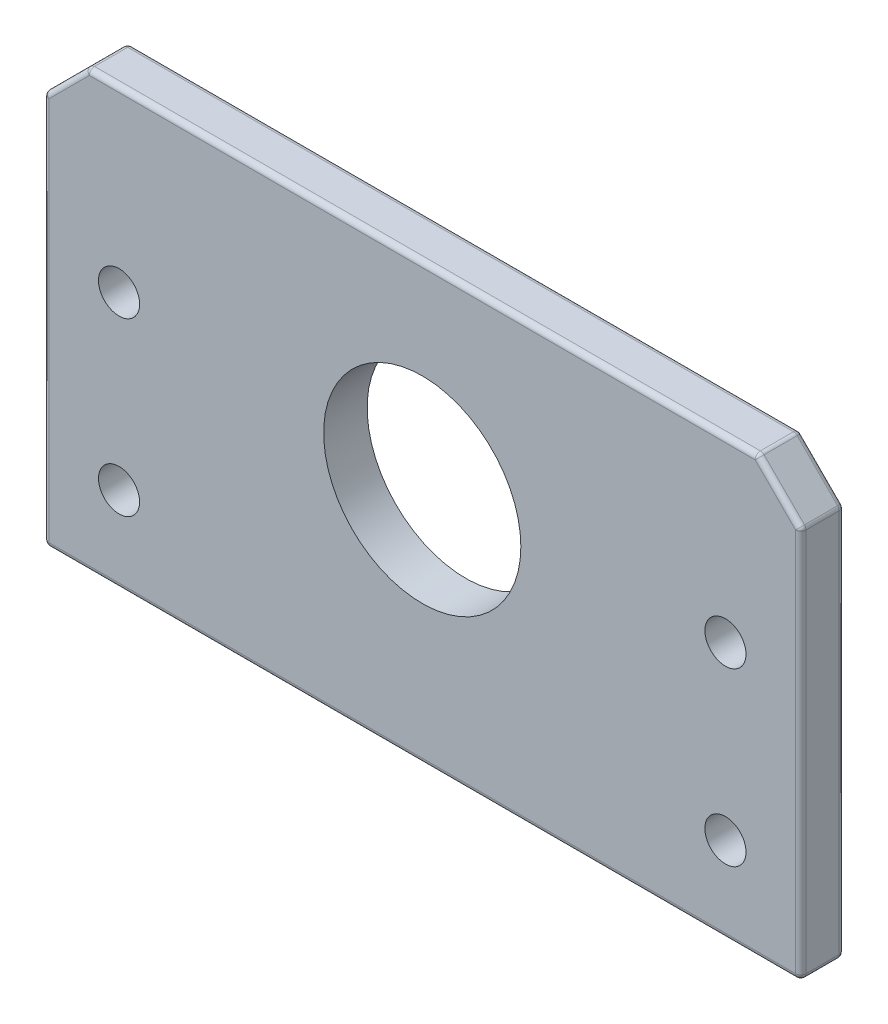
ISO-10303-21;
HEADER;
FILE_DESCRIPTION(('STEP AP214'),'2;1');
FILE_NAME('part.step','',(''),(''),'','','');
FILE_SCHEMA(('AUTOMOTIVE_DESIGN { 1 0 10303 214 1 1 1 1 }'));
ENDSEC;
DATA;
#1=APPLICATION_CONTEXT('core data for automotive mechanical design processes');
#2=APPLICATION_PROTOCOL_DEFINITION('international standard','automotive_design',2000,#1);
#3=PRODUCT_CONTEXT('',#1,'mechanical');
#4=PRODUCT('Part','Part','',(#3));
#5=PRODUCT_RELATED_PRODUCT_CATEGORY('part','',(#4));
#6=PRODUCT_DEFINITION_FORMATION('','',#4);
#7=PRODUCT_DEFINITION_CONTEXT('part definition',#1,'design');
#8=PRODUCT_DEFINITION('design','',#6,#7);
#9=PRODUCT_DEFINITION_SHAPE('','',#8);
#10=(LENGTH_UNIT() NAMED_UNIT(*) SI_UNIT(.MILLI.,.METRE.));
#11=(NAMED_UNIT(*) PLANE_ANGLE_UNIT() SI_UNIT($,.RADIAN.));
#12=(NAMED_UNIT(*) SI_UNIT($,.STERADIAN.) SOLID_ANGLE_UNIT());
#13=UNCERTAINTY_MEASURE_WITH_UNIT(LENGTH_MEASURE(1.E-05),#10,'distance_accuracy_value','');
#14=(GEOMETRIC_REPRESENTATION_CONTEXT(3) GLOBAL_UNCERTAINTY_ASSIGNED_CONTEXT((#13)) GLOBAL_UNIT_ASSIGNED_CONTEXT((#10,
#11,#12)) REPRESENTATION_CONTEXT('',''));
#15=CARTESIAN_POINT('',(0.,0.,0.));
#16=DIRECTION('',(0.,0.,1.));
#17=DIRECTION('',(1.,0.,0.));
#18=AXIS2_PLACEMENT_3D('',#15,#16,#17);
#19=CARTESIAN_POINT('',(-55.245,-63.5,3.175));
#20=DIRECTION('',(0.,0.,1.));
#21=DIRECTION('',(1.,0.,0.));
#22=AXIS2_PLACEMENT_3D('',#19,#20,#21);
#23=PLANE('',#22);
#24=DIRECTION('',(0.,1.,0.));
#25=VECTOR('',#24,1.);
#26=CARTESIAN_POINT('',(-54.483,-63.5,3.175));
#27=LINE('',#26,#25);
#28=CARTESIAN_POINT('',(-54.483,-6.66563073452831,3.175));
#29=VERTEX_POINT('',#28);
#30=CARTESIAN_POINT('',(-54.483,-62.738,3.175));
#31=VERTEX_POINT('',#30);
#32=EDGE_CURVE('E175',#29,#31,#27,.F.);
#33=ORIENTED_EDGE('',*,*,#32,.T.);
#34=DIRECTION('',(1.,0.,0.));
#35=VECTOR('',#34,1.);
#36=CARTESIAN_POINT('',(55.245,-62.738,3.175));
#37=LINE('',#36,#35);
#38=CARTESIAN_POINT('',(54.483,-62.738,3.175));
#39=VERTEX_POINT('',#38);
#40=EDGE_CURVE('E226',#31,#39,#37,.T.);
#41=ORIENTED_EDGE('',*,*,#40,.T.);
#42=DIRECTION('',(0.,1.,0.));
#43=VECTOR('',#42,1.);
#44=CARTESIAN_POINT('',(54.483,-63.5,3.175));
#45=LINE('',#44,#43);
#46=CARTESIAN_POINT('',(54.483,-6.66563073452829,3.175));
#47=VERTEX_POINT('',#46);
#48=EDGE_CURVE('E223',#39,#47,#45,.T.);
#49=ORIENTED_EDGE('',*,*,#48,.T.);
#50=DIRECTION('',(0.707106781186546,-0.707106781186549,0.));
#51=VECTOR('',#50,1.);
#52=CARTESIAN_POINT('',(28.0361846327361,19.7811846327357,3.175));
#53=LINE('',#52,#51);
#54=CARTESIAN_POINT('',(48.5793692654717,-0.762,3.175));
#55=VERTEX_POINT('',#54);
#56=EDGE_CURVE('E220',#47,#55,#53,.F.);
#57=ORIENTED_EDGE('',*,*,#56,.T.);
#58=DIRECTION('',(1.,0.,0.));
#59=VECTOR('',#58,1.);
#60=CARTESIAN_POINT('',(-55.245,-0.761999999999999,3.175));
#61=LINE('',#60,#59);
#62=CARTESIAN_POINT('',(-48.5793692654717,-0.762000000000001,3.175));
#63=VERTEX_POINT('',#62);
#64=EDGE_CURVE('E178',#55,#63,#61,.F.);
#65=ORIENTED_EDGE('',*,*,#64,.T.);
#66=DIRECTION('',(0.707106781186546,0.707106781186549,0.));
#67=VECTOR('',#66,1.);
#68=CARTESIAN_POINT('',(-83.2811846327358,-35.4638153672643,3.175));
#69=LINE('',#68,#67);
#70=EDGE_CURVE('E170',#63,#29,#69,.F.);
#71=ORIENTED_EDGE('',*,*,#70,.T.);
#72=EDGE_LOOP('',(#33,#41,#49,#57,#65,#71));
#73=FACE_BOUND('',#72,.T.);
#74=CARTESIAN_POINT('',(-44.245,-51.,3.175));
#75=DIRECTION('',(0.,0.,-1.));
#76=DIRECTION('',(-1.,0.,0.));
#77=AXIS2_PLACEMENT_3D('',#74,#75,#76);
#78=CIRCLE('',#77,3.);
#79=CARTESIAN_POINT('',(-47.245,-51.,3.175));
#80=VERTEX_POINT('',#79);
#81=EDGE_CURVE('E461',#80,#80,#78,.T.);
#82=ORIENTED_EDGE('',*,*,#81,.T.);
#83=EDGE_LOOP('',(#82));
#84=FACE_BOUND('',#83,.T.);
#85=CARTESIAN_POINT('',(44.245,-51.,3.175));
#86=DIRECTION('',(0.,0.,-1.));
#87=DIRECTION('',(-1.,0.,0.));
#88=AXIS2_PLACEMENT_3D('',#85,#86,#87);
#89=CIRCLE('',#88,3.);
#90=CARTESIAN_POINT('',(41.245,-51.,3.175));
#91=VERTEX_POINT('',#90);
#92=EDGE_CURVE('E469',#91,#91,#89,.T.);
#93=ORIENTED_EDGE('',*,*,#92,.T.);
#94=EDGE_LOOP('',(#93));
#95=FACE_BOUND('',#94,.T.);
#96=CARTESIAN_POINT('',(0.,-28.8150046,3.175));
#97=DIRECTION('',(0.,0.,1.));
#98=DIRECTION('',(1.,0.,0.));
#99=AXIS2_PLACEMENT_3D('',#96,#97,#98);
#100=CIRCLE('',#99,14.3891);
#101=CARTESIAN_POINT('',(14.3891,-28.8150046,3.175));
#102=VERTEX_POINT('',#101);
#103=EDGE_CURVE('E214',#102,#102,#100,.T.);
#104=ORIENTED_EDGE('',*,*,#103,.F.);
#105=EDGE_LOOP('',(#104));
#106=FACE_BOUND('',#105,.T.);
#107=CARTESIAN_POINT('',(44.245,-26.,3.175));
#108=DIRECTION('',(0.,0.,-1.));
#109=DIRECTION('',(-1.,0.,0.));
#110=AXIS2_PLACEMENT_3D('',#107,#108,#109);
#111=CIRCLE('',#110,3.);
#112=CARTESIAN_POINT('',(41.245,-26.,3.175));
#113=VERTEX_POINT('',#112);
#114=EDGE_CURVE('E477',#113,#113,#111,.T.);
#115=ORIENTED_EDGE('',*,*,#114,.T.);
#116=EDGE_LOOP('',(#115));
#117=FACE_BOUND('',#116,.T.);
#118=CARTESIAN_POINT('',(-44.245,-26.,3.175));
#119=DIRECTION('',(0.,0.,-1.));
#120=DIRECTION('',(-1.,0.,0.));
#121=AXIS2_PLACEMENT_3D('',#118,#119,#120);
#122=CIRCLE('',#121,3.);
#123=CARTESIAN_POINT('',(-47.245,-26.,3.175));
#124=VERTEX_POINT('',#123);
#125=EDGE_CURVE('E449',#124,#124,#122,.T.);
#126=ORIENTED_EDGE('',*,*,#125,.T.);
#127=EDGE_LOOP('',(#126));
#128=FACE_BOUND('',#127,.T.);
#129=ADVANCED_FACE('F45',(#73,#84,#95,#106,#117,#128),#23,.T.);
#130=CARTESIAN_POINT('',(-55.245,-63.5,-3.175));
#131=DIRECTION('',(-1.,0.,0.));
#132=DIRECTION('',(0.,0.,1.));
#133=AXIS2_PLACEMENT_3D('',#130,#131,#132);
#134=PLANE('',#133);
#135=DIRECTION('',(0.,1.,0.));
#136=VECTOR('',#135,1.);
#137=CARTESIAN_POINT('',(-55.245,-63.5,-2.413));
#138=LINE('',#137,#136);
#139=CARTESIAN_POINT('',(-55.245,-6.66563073452831,-2.413));
#140=VERTEX_POINT('',#139);
#141=CARTESIAN_POINT('',(-55.245,-62.738,-2.413));
#142=VERTEX_POINT('',#141);
#143=EDGE_CURVE('E55',#140,#142,#138,.F.);
#144=ORIENTED_EDGE('',*,*,#143,.T.);
#145=DIRECTION('',(0.,0.,1.));
#146=VECTOR('',#145,1.);
#147=CARTESIAN_POINT('',(-55.245,-62.738,3.175));
#148=LINE('',#147,#146);
#149=CARTESIAN_POINT('',(-55.245,-62.738,2.413));
#150=VERTEX_POINT('',#149);
#151=EDGE_CURVE('E11',#142,#150,#148,.T.);
#152=ORIENTED_EDGE('',*,*,#151,.T.);
#153=DIRECTION('',(0.,1.,0.));
#154=VECTOR('',#153,1.);
#155=CARTESIAN_POINT('',(-55.245,-63.5,2.413));
#156=LINE('',#155,#154);
#157=CARTESIAN_POINT('',(-55.245,-6.66563073452831,2.413));
#158=VERTEX_POINT('',#157);
#159=EDGE_CURVE('E312',#150,#158,#156,.T.);
#160=ORIENTED_EDGE('',*,*,#159,.T.);
#161=DIRECTION('',(0.,0.,1.));
#162=VECTOR('',#161,1.);
#163=CARTESIAN_POINT('',(-55.245,-6.66563073452831,-3.175));
#164=LINE('',#163,#162);
#165=EDGE_CURVE('E66',#158,#140,#164,.F.);
#166=ORIENTED_EDGE('',*,*,#165,.T.);
#167=EDGE_LOOP('',(#144,#152,#160,#166));
#168=FACE_BOUND('',#167,.T.);
#169=ADVANCED_FACE('F489',(#168),#134,.T.);
#170=CARTESIAN_POINT('',(-55.245,-63.5,-3.175));
#171=DIRECTION('',(0.,0.,-1.));
#172=DIRECTION('',(-1.,0.,0.));
#173=AXIS2_PLACEMENT_3D('',#170,#171,#172);
#174=PLANE('',#173);
#175=DIRECTION('',(0.,1.,0.));
#176=VECTOR('',#175,1.);
#177=CARTESIAN_POINT('',(54.483,-63.5,-3.175));
#178=LINE('',#177,#176);
#179=CARTESIAN_POINT('',(54.483,-6.66563073452829,-3.175));
#180=VERTEX_POINT('',#179);
#181=CARTESIAN_POINT('',(54.483,-62.738,-3.175));
#182=VERTEX_POINT('',#181);
#183=EDGE_CURVE('E254',#180,#182,#178,.F.);
#184=ORIENTED_EDGE('',*,*,#183,.T.);
#185=DIRECTION('',(-1.,0.,0.));
#186=VECTOR('',#185,1.);
#187=CARTESIAN_POINT('',(-55.245,-62.738,-3.175));
#188=LINE('',#187,#186);
#189=CARTESIAN_POINT('',(-54.483,-62.738,-3.175));
#190=VERTEX_POINT('',#189);
#191=EDGE_CURVE('E257',#182,#190,#188,.T.);
#192=ORIENTED_EDGE('',*,*,#191,.T.);
#193=DIRECTION('',(0.,1.,0.));
#194=VECTOR('',#193,1.);
#195=CARTESIAN_POINT('',(-54.483,-63.5,-3.175));
#196=LINE('',#195,#194);
#197=CARTESIAN_POINT('',(-54.483,-6.66563073452831,-3.175));
#198=VERTEX_POINT('',#197);
#199=EDGE_CURVE('E242',#190,#198,#196,.T.);
#200=ORIENTED_EDGE('',*,*,#199,.T.);
#201=DIRECTION('',(-0.707106781186546,-0.707106781186549,0.));
#202=VECTOR('',#201,1.);
#203=CARTESIAN_POINT('',(-83.2811846327358,-35.4638153672643,-3.175));
#204=LINE('',#203,#202);
#205=CARTESIAN_POINT('',(-48.5793692654717,-0.762,-3.175));
#206=VERTEX_POINT('',#205);
#207=EDGE_CURVE('E245',#198,#206,#204,.F.);
#208=ORIENTED_EDGE('',*,*,#207,.T.);
#209=DIRECTION('',(-1.,0.,0.));
#210=VECTOR('',#209,1.);
#211=CARTESIAN_POINT('',(-55.245,-0.761999999999999,-3.175));
#212=LINE('',#211,#210);
#213=CARTESIAN_POINT('',(48.5793692654717,-0.762,-3.175));
#214=VERTEX_POINT('',#213);
#215=EDGE_CURVE('E248',#206,#214,#212,.F.);
#216=ORIENTED_EDGE('',*,*,#215,.T.);
#217=DIRECTION('',(-0.707106781186546,0.707106781186549,0.));
#218=VECTOR('',#217,1.);
#219=CARTESIAN_POINT('',(28.0361846327361,19.7811846327357,-3.175));
#220=LINE('',#219,#218);
#221=EDGE_CURVE('E251',#214,#180,#220,.F.);
#222=ORIENTED_EDGE('',*,*,#221,.T.);
#223=EDGE_LOOP('',(#184,#192,#200,#208,#216,#222));
#224=FACE_BOUND('',#223,.T.);
#225=CARTESIAN_POINT('',(-44.245,-26.,-3.175));
#226=DIRECTION('',(0.,0.,-1.));
#227=DIRECTION('',(-1.,0.,0.));
#228=AXIS2_PLACEMENT_3D('',#225,#226,#227);
#229=CIRCLE('',#228,3.);
#230=CARTESIAN_POINT('',(-47.245,-26.,-3.175));
#231=VERTEX_POINT('',#230);
#232=EDGE_CURVE('E442',#231,#231,#229,.T.);
#233=ORIENTED_EDGE('',*,*,#232,.F.);
#234=EDGE_LOOP('',(#233));
#235=FACE_BOUND('',#234,.T.);
#236=CARTESIAN_POINT('',(-44.245,-51.,-3.175));
#237=DIRECTION('',(0.,0.,-1.));
#238=DIRECTION('',(-1.,0.,0.));
#239=AXIS2_PLACEMENT_3D('',#236,#237,#238);
#240=CIRCLE('',#239,3.);
#241=CARTESIAN_POINT('',(-47.245,-51.,-3.175));
#242=VERTEX_POINT('',#241);
#243=EDGE_CURVE('E455',#242,#242,#240,.T.);
#244=ORIENTED_EDGE('',*,*,#243,.F.);
#245=EDGE_LOOP('',(#244));
#246=FACE_BOUND('',#245,.T.);
#247=CARTESIAN_POINT('',(44.245,-51.,-3.175));
#248=DIRECTION('',(0.,0.,-1.));
#249=DIRECTION('',(-1.,0.,0.));
#250=AXIS2_PLACEMENT_3D('',#247,#248,#249);
#251=CIRCLE('',#250,3.);
#252=CARTESIAN_POINT('',(41.245,-51.,-3.175));
#253=VERTEX_POINT('',#252);
#254=EDGE_CURVE('E465',#253,#253,#251,.T.);
#255=ORIENTED_EDGE('',*,*,#254,.F.);
#256=EDGE_LOOP('',(#255));
#257=FACE_BOUND('',#256,.T.);
#258=CARTESIAN_POINT('',(44.245,-26.,-3.175));
#259=DIRECTION('',(0.,0.,-1.));
#260=DIRECTION('',(-1.,0.,0.));
#261=AXIS2_PLACEMENT_3D('',#258,#259,#260);
#262=CIRCLE('',#261,3.);
#263=CARTESIAN_POINT('',(41.245,-26.,-3.175));
#264=VERTEX_POINT('',#263);
#265=EDGE_CURVE('E473',#264,#264,#262,.T.);
#266=ORIENTED_EDGE('',*,*,#265,.F.);
#267=EDGE_LOOP('',(#266));
#268=FACE_BOUND('',#267,.T.);
#269=CARTESIAN_POINT('',(0.,-28.8150046,-3.175));
#270=DIRECTION('',(0.,0.,1.));
#271=DIRECTION('',(1.,0.,0.));
#272=AXIS2_PLACEMENT_3D('',#269,#270,#271);
#273=CIRCLE('',#272,14.3891);
#274=CARTESIAN_POINT('',(14.3891,-28.8150046,-3.175));
#275=VERTEX_POINT('',#274);
#276=EDGE_CURVE('E210',#275,#275,#273,.T.);
#277=ORIENTED_EDGE('',*,*,#276,.T.);
#278=EDGE_LOOP('',(#277));
#279=FACE_BOUND('',#278,.T.);
#280=ADVANCED_FACE('F529',(#224,#235,#246,#257,#268,#279),#174,.T.);
#281=CARTESIAN_POINT('',(55.245,-63.5,-3.175));
#282=DIRECTION('',(1.,0.,0.));
#283=DIRECTION('',(0.,0.,-1.));
#284=AXIS2_PLACEMENT_3D('',#281,#282,#283);
#285=PLANE('',#284);
#286=DIRECTION('',(0.,1.,0.));
#287=VECTOR('',#286,1.);
#288=CARTESIAN_POINT('',(55.245,-63.5,2.413));
#289=LINE('',#288,#287);
#290=CARTESIAN_POINT('',(55.245,-6.66563073452831,2.413));
#291=VERTEX_POINT('',#290);
#292=CARTESIAN_POINT('',(55.245,-62.738,2.413));
#293=VERTEX_POINT('',#292);
#294=EDGE_CURVE('E267',#291,#293,#289,.F.);
#295=ORIENTED_EDGE('',*,*,#294,.T.);
#296=DIRECTION('',(0.,0.,-1.));
#297=VECTOR('',#296,1.);
#298=CARTESIAN_POINT('',(55.245,-62.738,-3.175));
#299=LINE('',#298,#297);
#300=CARTESIAN_POINT('',(55.245,-62.738,-2.413));
#301=VERTEX_POINT('',#300);
#302=EDGE_CURVE('E270',#293,#301,#299,.T.);
#303=ORIENTED_EDGE('',*,*,#302,.T.);
#304=DIRECTION('',(0.,1.,0.));
#305=VECTOR('',#304,1.);
#306=CARTESIAN_POINT('',(55.245,-63.5,-2.413));
#307=LINE('',#306,#305);
#308=CARTESIAN_POINT('',(55.245,-6.66563073452831,-2.413));
#309=VERTEX_POINT('',#308);
#310=EDGE_CURVE('E264',#301,#309,#307,.T.);
#311=ORIENTED_EDGE('',*,*,#310,.T.);
#312=DIRECTION('',(0.,0.,-1.));
#313=VECTOR('',#312,1.);
#314=CARTESIAN_POINT('',(55.245,-6.66563073452831,-3.175));
#315=LINE('',#314,#313);
#316=EDGE_CURVE('E261',#309,#291,#315,.F.);
#317=ORIENTED_EDGE('',*,*,#316,.T.);
#318=EDGE_LOOP('',(#295,#303,#311,#317));
#319=FACE_BOUND('',#318,.T.);
#320=ADVANCED_FACE('F524',(#319),#285,.T.);
#321=CARTESIAN_POINT('',(0.,-63.5,0.));
#322=DIRECTION('',(0.,1.,0.));
#323=DIRECTION('',(0.,0.,1.));
#324=AXIS2_PLACEMENT_3D('',#321,#322,#323);
#325=PLANE('',#324);
#326=DIRECTION('',(-1.,0.,0.));
#327=VECTOR('',#326,1.);
#328=CARTESIAN_POINT('',(55.245,-63.5,-2.413));
#329=LINE('',#328,#327);
#330=CARTESIAN_POINT('',(-54.483,-63.5,-2.413));
#331=VERTEX_POINT('',#330);
#332=CARTESIAN_POINT('',(54.483,-63.5,-2.413));
#333=VERTEX_POINT('',#332);
#334=EDGE_CURVE('E232',#331,#333,#329,.F.);
#335=ORIENTED_EDGE('',*,*,#334,.T.);
#336=DIRECTION('',(0.,0.,-1.));
#337=VECTOR('',#336,1.);
#338=CARTESIAN_POINT('',(54.483,-63.5,3.175));
#339=LINE('',#338,#337);
#340=CARTESIAN_POINT('',(54.483,-63.5,2.413));
#341=VERTEX_POINT('',#340);
#342=EDGE_CURVE('E239',#333,#341,#339,.F.);
#343=ORIENTED_EDGE('',*,*,#342,.T.);
#344=DIRECTION('',(1.,0.,0.));
#345=VECTOR('',#344,1.);
#346=CARTESIAN_POINT('',(-55.245,-63.5,2.413));
#347=LINE('',#346,#345);
#348=CARTESIAN_POINT('',(-54.483,-63.5,2.413));
#349=VERTEX_POINT('',#348);
#350=EDGE_CURVE('E235',#341,#349,#347,.F.);
#351=ORIENTED_EDGE('',*,*,#350,.T.);
#352=DIRECTION('',(0.,0.,1.));
#353=VECTOR('',#352,1.);
#354=CARTESIAN_POINT('',(-54.483,-63.5,-3.175));
#355=LINE('',#354,#353);
#356=EDGE_CURVE('E229',#349,#331,#355,.F.);
#357=ORIENTED_EDGE('',*,*,#356,.T.);
#358=EDGE_LOOP('',(#335,#343,#351,#357));
#359=FACE_BOUND('',#358,.T.);
#360=ADVANCED_FACE('F521',(#359),#325,.F.);
#361=CARTESIAN_POINT('',(0.,0.,0.));
#362=DIRECTION('',(0.,1.,0.));
#363=DIRECTION('',(0.,0.,1.));
#364=AXIS2_PLACEMENT_3D('',#361,#362,#363);
#365=PLANE('',#364);
#366=DIRECTION('',(1.,0.,0.));
#367=VECTOR('',#366,1.);
#368=CARTESIAN_POINT('',(0.,0.,2.413));
#369=LINE('',#368,#367);
#370=CARTESIAN_POINT('',(-48.5793692654717,0.,2.413));
#371=VERTEX_POINT('',#370);
#372=CARTESIAN_POINT('',(48.5793692654717,0.,2.413));
#373=VERTEX_POINT('',#372);
#374=EDGE_CURVE('E293',#371,#373,#369,.T.);
#375=ORIENTED_EDGE('',*,*,#374,.T.);
#376=DIRECTION('',(0.,0.,1.));
#377=VECTOR('',#376,1.);
#378=CARTESIAN_POINT('',(48.5793692654717,0.,0.));
#379=LINE('',#378,#377);
#380=CARTESIAN_POINT('',(48.5793692654717,0.,-2.413));
#381=VERTEX_POINT('',#380);
#382=EDGE_CURVE('E296',#373,#381,#379,.F.);
#383=ORIENTED_EDGE('',*,*,#382,.T.);
#384=DIRECTION('',(-1.,0.,0.));
#385=VECTOR('',#384,1.);
#386=CARTESIAN_POINT('',(0.,0.,-2.413));
#387=LINE('',#386,#385);
#388=CARTESIAN_POINT('',(-48.5793692654717,0.,-2.413));
#389=VERTEX_POINT('',#388);
#390=EDGE_CURVE('E290',#381,#389,#387,.T.);
#391=ORIENTED_EDGE('',*,*,#390,.T.);
#392=DIRECTION('',(0.,0.,-1.));
#393=VECTOR('',#392,1.);
#394=CARTESIAN_POINT('',(-48.5793692654717,0.,0.));
#395=LINE('',#394,#393);
#396=EDGE_CURVE('E287',#389,#371,#395,.F.);
#397=ORIENTED_EDGE('',*,*,#396,.T.);
#398=EDGE_LOOP('',(#375,#383,#391,#397));
#399=FACE_BOUND('',#398,.T.);
#400=ADVANCED_FACE('F519',(#399),#365,.T.);
#401=CARTESIAN_POINT('',(0.,-28.8150046,-3.175));
#402=DIRECTION('',(0.,0.,1.));
#403=DIRECTION('',(1.,0.,0.));
#404=AXIS2_PLACEMENT_3D('',#401,#402,#403);
#405=CYLINDRICAL_SURFACE('',#404,14.3891);
#406=ORIENTED_EDGE('',*,*,#276,.F.);
#407=EDGE_LOOP('',(#406));
#408=FACE_BOUND('',#407,.T.);
#409=ORIENTED_EDGE('',*,*,#103,.T.);
#410=EDGE_LOOP('',(#409));
#411=FACE_BOUND('',#410,.T.);
#412=ADVANCED_FACE('F486',(#408,#411),#405,.F.);
#413=CARTESIAN_POINT('',(-48.895,0.,0.));
#414=DIRECTION('',(0.707106781186549,-0.707106781186546,0.));
#415=DIRECTION('',(0.,0.,1.));
#416=AXIS2_PLACEMENT_3D('',#413,#414,#415);
#417=PLANE('',#416);
#418=DIRECTION('',(-0.707106781186546,-0.707106781186549,0.));
#419=VECTOR('',#418,1.);
#420=CARTESIAN_POINT('',(-48.895,0.,2.413));
#421=LINE('',#420,#419);
#422=CARTESIAN_POINT('',(-55.0218153672642,-6.12681536726416,2.413));
#423=VERTEX_POINT('',#422);
#424=CARTESIAN_POINT('',(-49.1181846327359,-0.223184632735852,2.413));
#425=VERTEX_POINT('',#424);
#426=EDGE_CURVE('E189',#423,#425,#421,.F.);
#427=ORIENTED_EDGE('',*,*,#426,.T.);
#428=DIRECTION('',(0.,0.,1.));
#429=VECTOR('',#428,1.);
#430=CARTESIAN_POINT('',(-49.1181846327359,-0.223184632735851,0.));
#431=LINE('',#430,#429);
#432=CARTESIAN_POINT('',(-49.1181846327359,-0.223184632735852,-2.413));
#433=VERTEX_POINT('',#432);
#434=EDGE_CURVE('E308',#425,#433,#431,.F.);
#435=ORIENTED_EDGE('',*,*,#434,.T.);
#436=DIRECTION('',(0.707106781186546,0.707106781186549,0.));
#437=VECTOR('',#436,1.);
#438=CARTESIAN_POINT('',(-48.895,0.,-2.413));
#439=LINE('',#438,#437);
#440=CARTESIAN_POINT('',(-55.0218153672642,-6.12681536726416,-2.413));
#441=VERTEX_POINT('',#440);
#442=EDGE_CURVE('E303',#433,#441,#439,.F.);
#443=ORIENTED_EDGE('',*,*,#442,.T.);
#444=DIRECTION('',(0.,0.,-1.));
#445=VECTOR('',#444,1.);
#446=CARTESIAN_POINT('',(-55.0218153672642,-6.12681536726416,0.));
#447=LINE('',#446,#445);
#448=EDGE_CURVE('E300',#441,#423,#447,.F.);
#449=ORIENTED_EDGE('',*,*,#448,.T.);
#450=EDGE_LOOP('',(#427,#435,#443,#449));
#451=FACE_BOUND('',#450,.T.);
#452=ADVANCED_FACE('F518',(#451),#417,.F.);
#453=CARTESIAN_POINT('',(48.895,0.,0.));
#454=DIRECTION('',(-0.707106781186549,-0.707106781186546,0.));
#455=DIRECTION('',(0.,0.,-1.));
#456=AXIS2_PLACEMENT_3D('',#453,#454,#455);
#457=PLANE('',#456);
#458=DIRECTION('',(0.,0.,1.));
#459=VECTOR('',#458,1.);
#460=CARTESIAN_POINT('',(55.0218153672642,-6.12681536726416,0.));
#461=LINE('',#460,#459);
#462=CARTESIAN_POINT('',(55.0218153672642,-6.12681536726416,2.413));
#463=VERTEX_POINT('',#462);
#464=CARTESIAN_POINT('',(55.0218153672642,-6.12681536726416,-2.413));
#465=VERTEX_POINT('',#464);
#466=EDGE_CURVE('E280',#463,#465,#461,.F.);
#467=ORIENTED_EDGE('',*,*,#466,.T.);
#468=DIRECTION('',(0.707106781186546,-0.707106781186549,0.));
#469=VECTOR('',#468,1.);
#470=CARTESIAN_POINT('',(48.895,0.,-2.413));
#471=LINE('',#470,#469);
#472=CARTESIAN_POINT('',(49.1181846327359,-0.223184632735851,-2.413));
#473=VERTEX_POINT('',#472);
#474=EDGE_CURVE('E283',#465,#473,#471,.F.);
#475=ORIENTED_EDGE('',*,*,#474,.T.);
#476=DIRECTION('',(0.,0.,-1.));
#477=VECTOR('',#476,1.);
#478=CARTESIAN_POINT('',(49.1181846327359,-0.223184632735851,0.));
#479=LINE('',#478,#477);
#480=CARTESIAN_POINT('',(49.1181846327359,-0.223184632735851,2.413));
#481=VERTEX_POINT('',#480);
#482=EDGE_CURVE('E274',#473,#481,#479,.F.);
#483=ORIENTED_EDGE('',*,*,#482,.T.);
#484=DIRECTION('',(-0.707106781186546,0.707106781186549,0.));
#485=VECTOR('',#484,1.);
#486=CARTESIAN_POINT('',(48.895,0.,2.413));
#487=LINE('',#486,#485);
#488=EDGE_CURVE('E277',#481,#463,#487,.F.);
#489=ORIENTED_EDGE('',*,*,#488,.T.);
#490=EDGE_LOOP('',(#467,#475,#483,#489));
#491=FACE_BOUND('',#490,.T.);
#492=ADVANCED_FACE('F514',(#491),#457,.F.);
#493=CARTESIAN_POINT('',(44.245,-26.,-3.175));
#494=DIRECTION('',(0.,0.,-1.));
#495=DIRECTION('',(-1.,0.,0.));
#496=AXIS2_PLACEMENT_3D('',#493,#494,#495);
#497=CYLINDRICAL_SURFACE('',#496,3.);
#498=ORIENTED_EDGE('',*,*,#114,.F.);
#499=EDGE_LOOP('',(#498));
#500=FACE_BOUND('',#499,.T.);
#501=ORIENTED_EDGE('',*,*,#265,.T.);
#502=EDGE_LOOP('',(#501));
#503=FACE_BOUND('',#502,.T.);
#504=ADVANCED_FACE('F510',(#500,#503),#497,.F.);
#505=CARTESIAN_POINT('',(44.245,-51.,-3.175));
#506=DIRECTION('',(0.,0.,-1.));
#507=DIRECTION('',(-1.,0.,0.));
#508=AXIS2_PLACEMENT_3D('',#505,#506,#507);
#509=CYLINDRICAL_SURFACE('',#508,3.);
#510=ORIENTED_EDGE('',*,*,#92,.F.);
#511=EDGE_LOOP('',(#510));
#512=FACE_BOUND('',#511,.T.);
#513=ORIENTED_EDGE('',*,*,#254,.T.);
#514=EDGE_LOOP('',(#513));
#515=FACE_BOUND('',#514,.T.);
#516=ADVANCED_FACE('F504',(#512,#515),#509,.F.);
#517=CARTESIAN_POINT('',(-44.245,-51.,-3.175));
#518=DIRECTION('',(0.,0.,-1.));
#519=DIRECTION('',(-1.,0.,0.));
#520=AXIS2_PLACEMENT_3D('',#517,#518,#519);
#521=CYLINDRICAL_SURFACE('',#520,3.);
#522=ORIENTED_EDGE('',*,*,#81,.F.);
#523=EDGE_LOOP('',(#522));
#524=FACE_BOUND('',#523,.T.);
#525=ORIENTED_EDGE('',*,*,#243,.T.);
#526=EDGE_LOOP('',(#525));
#527=FACE_BOUND('',#526,.T.);
#528=ADVANCED_FACE('F496',(#524,#527),#521,.F.);
#529=CARTESIAN_POINT('',(-44.245,-26.,-3.175));
#530=DIRECTION('',(0.,0.,-1.));
#531=DIRECTION('',(-1.,0.,0.));
#532=AXIS2_PLACEMENT_3D('',#529,#530,#531);
#533=CYLINDRICAL_SURFACE('',#532,3.);
#534=ORIENTED_EDGE('',*,*,#125,.F.);
#535=EDGE_LOOP('',(#534));
#536=FACE_BOUND('',#535,.T.);
#537=ORIENTED_EDGE('',*,*,#232,.T.);
#538=EDGE_LOOP('',(#537));
#539=FACE_BOUND('',#538,.T.);
#540=ADVANCED_FACE('F494',(#536,#539),#533,.F.);
#541=CARTESIAN_POINT('',(0.,-0.762,-2.413));
#542=DIRECTION('',(-1.,0.,0.));
#543=DIRECTION('',(0.,0.,1.));
#544=AXIS2_PLACEMENT_3D('',#541,#542,#543);
#545=CYLINDRICAL_SURFACE('',#544,0.762);
#546=CARTESIAN_POINT('',(-48.5793692654717,-0.762,-2.413));
#547=DIRECTION('',(-1.,0.,0.));
#548=DIRECTION('',(0.,0.,1.));
#549=AXIS2_PLACEMENT_3D('',#546,#547,#548);
#550=CIRCLE('',#549,0.762);
#551=EDGE_CURVE('E49',#389,#206,#550,.T.);
#552=ORIENTED_EDGE('',*,*,#551,.F.);
#553=ORIENTED_EDGE('',*,*,#390,.F.);
#554=CARTESIAN_POINT('',(48.5793692654717,-0.762,-2.413));
#555=DIRECTION('',(1.,0.,0.));
#556=DIRECTION('',(0.,1.,0.));
#557=AXIS2_PLACEMENT_3D('',#554,#555,#556);
#558=CIRCLE('',#557,0.762);
#559=EDGE_CURVE('E432',#214,#381,#558,.T.);
#560=ORIENTED_EDGE('',*,*,#559,.F.);
#561=ORIENTED_EDGE('',*,*,#215,.F.);
#562=EDGE_LOOP('',(#552,#553,#560,#561));
#563=FACE_BOUND('',#562,.T.);
#564=ADVANCED_FACE('F47',(#563),#545,.T.);
#565=CARTESIAN_POINT('',(-48.5793692654717,-0.762,-2.413));
#566=DIRECTION('',(0.,0.,-1.));
#567=DIRECTION('',(-1.,0.,0.));
#568=AXIS2_PLACEMENT_3D('',#565,#566,#567);
#569=SPHERICAL_SURFACE('',#568,0.762);
#570=CARTESIAN_POINT('',(-48.5793692654717,-0.761999999999999,-2.413));
#571=DIRECTION('',(0.,0.,-1.));
#572=DIRECTION('',(-1.,0.,0.));
#573=AXIS2_PLACEMENT_3D('',#570,#571,#572);
#574=CIRCLE('',#573,0.762);
#575=EDGE_CURVE('E425',#389,#433,#574,.F.);
#576=ORIENTED_EDGE('',*,*,#575,.F.);
#577=ORIENTED_EDGE('',*,*,#551,.T.);
#578=CARTESIAN_POINT('',(-48.5793692654717,-0.762,-2.413));
#579=DIRECTION('',(0.707106781186543,0.707106781186552,0.));
#580=DIRECTION('',(-0.707106781186552,0.707106781186543,0.));
#581=AXIS2_PLACEMENT_3D('',#578,#579,#580);
#582=CIRCLE('',#581,0.762);
#583=EDGE_CURVE('E429',#433,#206,#582,.F.);
#584=ORIENTED_EDGE('',*,*,#583,.F.);
#585=EDGE_LOOP('',(#576,#577,#584));
#586=FACE_BOUND('',#585,.T.);
#587=ADVANCED_FACE('F502',(#586),#569,.T.);
#588=CARTESIAN_POINT('',(48.5793692654717,-0.762,-2.413));
#589=DIRECTION('',(0.,0.,-1.));
#590=DIRECTION('',(-1.,0.,0.));
#591=AXIS2_PLACEMENT_3D('',#588,#589,#590);
#592=SPHERICAL_SURFACE('',#591,0.762);
#593=CARTESIAN_POINT('',(48.5793692654717,-0.762,-2.413));
#594=DIRECTION('',(-0.707106781186548,0.707106781186547,0.));
#595=DIRECTION('',(-0.707106781186547,-0.707106781186548,0.));
#596=AXIS2_PLACEMENT_3D('',#593,#594,#595);
#597=CIRCLE('',#596,0.762);
#598=EDGE_CURVE('E418',#214,#473,#597,.F.);
#599=ORIENTED_EDGE('',*,*,#598,.F.);
#600=ORIENTED_EDGE('',*,*,#559,.T.);
#601=CARTESIAN_POINT('',(48.5793692654717,-0.762,-2.413));
#602=DIRECTION('',(0.,0.,-1.));
#603=DIRECTION('',(-1.,0.,0.));
#604=AXIS2_PLACEMENT_3D('',#601,#602,#603);
#605=CIRCLE('',#604,0.762);
#606=EDGE_CURVE('E422',#473,#381,#605,.F.);
#607=ORIENTED_EDGE('',*,*,#606,.F.);
#608=EDGE_LOOP('',(#599,#600,#607));
#609=FACE_BOUND('',#608,.T.);
#610=ADVANCED_FACE('F651',(#609),#592,.T.);
#611=CARTESIAN_POINT('',(-83.2811846327358,-35.4638153672643,-2.413));
#612=DIRECTION('',(-0.707106781186546,-0.707106781186549,0.));
#613=DIRECTION('',(0.707106781186549,-0.707106781186546,0.));
#614=AXIS2_PLACEMENT_3D('',#611,#612,#613);
#615=CYLINDRICAL_SURFACE('',#614,0.762);
#616=ORIENTED_EDGE('',*,*,#583,.T.);
#617=ORIENTED_EDGE('',*,*,#207,.F.);
#618=CARTESIAN_POINT('',(-54.483,-6.66563073452831,-2.413));
#619=DIRECTION('',(-0.707106781186548,-0.707106781186548,0.));
#620=DIRECTION('',(0.707106781186548,-0.707106781186548,0.));
#621=AXIS2_PLACEMENT_3D('',#618,#619,#620);
#622=CIRCLE('',#621,0.762);
#623=EDGE_CURVE('E414',#441,#198,#622,.T.);
#624=ORIENTED_EDGE('',*,*,#623,.F.);
#625=ORIENTED_EDGE('',*,*,#442,.F.);
#626=EDGE_LOOP('',(#616,#617,#624,#625));
#627=FACE_BOUND('',#626,.T.);
#628=ADVANCED_FACE('F647',(#627),#615,.T.);
#629=CARTESIAN_POINT('',(-48.5793692654717,-0.762,0.));
#630=DIRECTION('',(0.,0.,-1.));
#631=DIRECTION('',(-1.,0.,0.));
#632=AXIS2_PLACEMENT_3D('',#629,#630,#631);
#633=CYLINDRICAL_SURFACE('',#632,0.762);
#634=ORIENTED_EDGE('',*,*,#575,.T.);
#635=ORIENTED_EDGE('',*,*,#434,.F.);
#636=CARTESIAN_POINT('',(-48.5793692654717,-0.762,2.413));
#637=DIRECTION('',(0.,0.,1.));
#638=DIRECTION('',(1.,0.,0.));
#639=AXIS2_PLACEMENT_3D('',#636,#637,#638);
#640=CIRCLE('',#639,0.762);
#641=EDGE_CURVE('E410',#371,#425,#640,.T.);
#642=ORIENTED_EDGE('',*,*,#641,.F.);
#643=ORIENTED_EDGE('',*,*,#396,.F.);
#644=EDGE_LOOP('',(#634,#635,#642,#643));
#645=FACE_BOUND('',#644,.T.);
#646=ADVANCED_FACE('F643',(#645),#633,.T.);
#647=CARTESIAN_POINT('',(0.,-0.762,2.413));
#648=DIRECTION('',(1.,0.,0.));
#649=DIRECTION('',(0.,0.,-1.));
#650=AXIS2_PLACEMENT_3D('',#647,#648,#649);
#651=CYLINDRICAL_SURFACE('',#650,0.762);
#652=CARTESIAN_POINT('',(48.5793692654717,-0.762,2.413));
#653=DIRECTION('',(1.,0.,0.));
#654=DIRECTION('',(0.,0.,-1.));
#655=AXIS2_PLACEMENT_3D('',#652,#653,#654);
#656=CIRCLE('',#655,0.762);
#657=EDGE_CURVE('E402',#373,#55,#656,.T.);
#658=ORIENTED_EDGE('',*,*,#657,.F.);
#659=ORIENTED_EDGE('',*,*,#374,.F.);
#660=CARTESIAN_POINT('',(-48.5793692654717,-0.762,2.413));
#661=DIRECTION('',(-1.,0.,0.));
#662=DIRECTION('',(0.,-1.,0.));
#663=AXIS2_PLACEMENT_3D('',#660,#661,#662);
#664=CIRCLE('',#663,0.762);
#665=EDGE_CURVE('E406',#63,#371,#664,.T.);
#666=ORIENTED_EDGE('',*,*,#665,.F.);
#667=ORIENTED_EDGE('',*,*,#64,.F.);
#668=EDGE_LOOP('',(#658,#659,#666,#667));
#669=FACE_BOUND('',#668,.T.);
#670=ADVANCED_FACE('F639',(#669),#651,.T.);
#671=CARTESIAN_POINT('',(48.5793692654717,-0.762,0.));
#672=DIRECTION('',(0.,0.,1.));
#673=DIRECTION('',(1.,0.,0.));
#674=AXIS2_PLACEMENT_3D('',#671,#672,#673);
#675=CYLINDRICAL_SURFACE('',#674,0.762);
#676=ORIENTED_EDGE('',*,*,#606,.T.);
#677=ORIENTED_EDGE('',*,*,#382,.F.);
#678=CARTESIAN_POINT('',(48.5793692654717,-0.761999999999999,2.413));
#679=DIRECTION('',(0.,0.,1.));
#680=DIRECTION('',(1.,0.,0.));
#681=AXIS2_PLACEMENT_3D('',#678,#679,#680);
#682=CIRCLE('',#681,0.762);
#683=EDGE_CURVE('E398',#481,#373,#682,.T.);
#684=ORIENTED_EDGE('',*,*,#683,.F.);
#685=ORIENTED_EDGE('',*,*,#482,.F.);
#686=EDGE_LOOP('',(#676,#677,#684,#685));
#687=FACE_BOUND('',#686,.T.);
#688=ADVANCED_FACE('F635',(#687),#675,.T.);
#689=CARTESIAN_POINT('',(28.0361846327361,19.7811846327357,-2.413));
#690=DIRECTION('',(-0.707106781186546,0.707106781186549,0.));
#691=DIRECTION('',(-0.707106781186549,-0.707106781186546,0.));
#692=AXIS2_PLACEMENT_3D('',#689,#690,#691);
#693=CYLINDRICAL_SURFACE('',#692,0.762);
#694=ORIENTED_EDGE('',*,*,#598,.T.);
#695=ORIENTED_EDGE('',*,*,#474,.F.);
#696=CARTESIAN_POINT('',(54.483,-6.66563073452829,-2.413));
#697=DIRECTION('',(0.707106781186531,-0.707106781186563,0.));
#698=DIRECTION('',(0.707106781186564,0.707106781186532,0.));
#699=AXIS2_PLACEMENT_3D('',#696,#697,#698);
#700=CIRCLE('',#699,0.762);
#701=EDGE_CURVE('E394',#180,#465,#700,.T.);
#702=ORIENTED_EDGE('',*,*,#701,.F.);
#703=ORIENTED_EDGE('',*,*,#221,.F.);
#704=EDGE_LOOP('',(#694,#695,#702,#703));
#705=FACE_BOUND('',#704,.T.);
#706=ADVANCED_FACE('F631',(#705),#693,.T.);
#707=CARTESIAN_POINT('',(-54.483,-6.6656307345283,-2.413));
#708=DIRECTION('',(0.,0.,-1.));
#709=DIRECTION('',(0.,1.,0.));
#710=AXIS2_PLACEMENT_3D('',#707,#708,#709);
#711=SPHERICAL_SURFACE('',#710,0.762);
#712=CARTESIAN_POINT('',(-54.483,-6.66563073452831,-2.413));
#713=DIRECTION('',(0.,0.,-1.));
#714=DIRECTION('',(-1.,0.,0.));
#715=AXIS2_PLACEMENT_3D('',#712,#713,#714);
#716=CIRCLE('',#715,0.762);
#717=EDGE_CURVE('E387',#441,#140,#716,.F.);
#718=ORIENTED_EDGE('',*,*,#717,.F.);
#719=ORIENTED_EDGE('',*,*,#623,.T.);
#720=CARTESIAN_POINT('',(-54.483,-6.66563073452831,-2.413));
#721=DIRECTION('',(0.,1.,0.));
#722=DIRECTION('',(0.,0.,1.));
#723=AXIS2_PLACEMENT_3D('',#720,#721,#722);
#724=CIRCLE('',#723,0.762);
#725=EDGE_CURVE('E390',#140,#198,#724,.F.);
#726=ORIENTED_EDGE('',*,*,#725,.F.);
#727=EDGE_LOOP('',(#718,#719,#726));
#728=FACE_BOUND('',#727,.T.);
#729=ADVANCED_FACE('F627',(#728),#711,.T.);
#730=CARTESIAN_POINT('',(-48.5793692654717,-0.762,2.413));
#731=DIRECTION('',(0.,0.,1.));
#732=DIRECTION('',(0.,-1.,0.));
#733=AXIS2_PLACEMENT_3D('',#730,#731,#732);
#734=SPHERICAL_SURFACE('',#733,0.762);
#735=ORIENTED_EDGE('',*,*,#665,.T.);
#736=ORIENTED_EDGE('',*,*,#641,.T.);
#737=CARTESIAN_POINT('',(-48.5793692654717,-0.762,2.413));
#738=DIRECTION('',(0.707106781186548,0.707106781186547,0.));
#739=DIRECTION('',(-0.707106781186547,0.707106781186548,0.));
#740=AXIS2_PLACEMENT_3D('',#737,#738,#739);
#741=CIRCLE('',#740,0.762);
#742=EDGE_CURVE('E384',#63,#425,#741,.F.);
#743=ORIENTED_EDGE('',*,*,#742,.F.);
#744=EDGE_LOOP('',(#735,#736,#743));
#745=FACE_BOUND('',#744,.T.);
#746=ADVANCED_FACE('F623',(#745),#734,.T.);
#747=CARTESIAN_POINT('',(48.5793692654717,-0.762,2.413));
#748=DIRECTION('',(0.,0.,1.));
#749=DIRECTION('',(1.,0.,0.));
#750=AXIS2_PLACEMENT_3D('',#747,#748,#749);
#751=SPHERICAL_SURFACE('',#750,0.762);
#752=ORIENTED_EDGE('',*,*,#683,.T.);
#753=ORIENTED_EDGE('',*,*,#657,.T.);
#754=CARTESIAN_POINT('',(48.5793692654717,-0.762000000000002,2.413));
#755=DIRECTION('',(-0.707106781186558,0.707106781186537,0.));
#756=DIRECTION('',(-0.707106781186537,-0.707106781186558,0.));
#757=AXIS2_PLACEMENT_3D('',#754,#755,#756);
#758=CIRCLE('',#757,0.762);
#759=EDGE_CURVE('E380',#481,#55,#758,.F.);
#760=ORIENTED_EDGE('',*,*,#759,.F.);
#761=EDGE_LOOP('',(#752,#753,#760));
#762=FACE_BOUND('',#761,.T.);
#763=ADVANCED_FACE('F619',(#762),#751,.T.);
#764=CARTESIAN_POINT('',(54.483,-6.6656307345283,-2.413));
#765=DIRECTION('',(0.,0.,-1.));
#766=DIRECTION('',(0.,1.,0.));
#767=AXIS2_PLACEMENT_3D('',#764,#765,#766);
#768=SPHERICAL_SURFACE('',#767,0.762);
#769=CARTESIAN_POINT('',(54.483,-6.66563073452831,-2.413));
#770=DIRECTION('',(0.,1.,0.));
#771=DIRECTION('',(0.,0.,1.));
#772=AXIS2_PLACEMENT_3D('',#769,#770,#771);
#773=CIRCLE('',#772,0.762);
#774=EDGE_CURVE('E372',#180,#309,#773,.F.);
#775=ORIENTED_EDGE('',*,*,#774,.F.);
#776=ORIENTED_EDGE('',*,*,#701,.T.);
#777=CARTESIAN_POINT('',(54.483,-6.66563073452831,-2.413));
#778=DIRECTION('',(0.,0.,-1.));
#779=DIRECTION('',(-1.,0.,0.));
#780=AXIS2_PLACEMENT_3D('',#777,#778,#779);
#781=CIRCLE('',#780,0.762);
#782=EDGE_CURVE('E376',#309,#465,#781,.F.);
#783=ORIENTED_EDGE('',*,*,#782,.F.);
#784=EDGE_LOOP('',(#775,#776,#783));
#785=FACE_BOUND('',#784,.T.);
#786=ADVANCED_FACE('F615',(#785),#768,.T.);
#787=CARTESIAN_POINT('',(-54.483,-63.5,-2.413));
#788=DIRECTION('',(0.,1.,0.));
#789=DIRECTION('',(0.,0.,1.));
#790=AXIS2_PLACEMENT_3D('',#787,#788,#789);
#791=CYLINDRICAL_SURFACE('',#790,0.762);
#792=ORIENTED_EDGE('',*,*,#725,.T.);
#793=ORIENTED_EDGE('',*,*,#199,.F.);
#794=CARTESIAN_POINT('',(-54.483,-62.738,-2.413));
#795=DIRECTION('',(0.,-1.,0.));
#796=DIRECTION('',(0.,0.,-1.));
#797=AXIS2_PLACEMENT_3D('',#794,#795,#796);
#798=CIRCLE('',#797,0.762);
#799=EDGE_CURVE('E365',#142,#190,#798,.T.);
#800=ORIENTED_EDGE('',*,*,#799,.F.);
#801=ORIENTED_EDGE('',*,*,#143,.F.);
#802=EDGE_LOOP('',(#792,#793,#800,#801));
#803=FACE_BOUND('',#802,.T.);
#804=ADVANCED_FACE('F611',(#803),#791,.T.);
#805=CARTESIAN_POINT('',(-54.483,-6.66563073452831,-3.175));
#806=DIRECTION('',(0.,0.,1.));
#807=DIRECTION('',(1.,0.,0.));
#808=AXIS2_PLACEMENT_3D('',#805,#806,#807);
#809=CYLINDRICAL_SURFACE('',#808,0.762);
#810=ORIENTED_EDGE('',*,*,#717,.T.);
#811=ORIENTED_EDGE('',*,*,#165,.F.);
#812=CARTESIAN_POINT('',(-54.483,-6.66563073452831,2.413));
#813=DIRECTION('',(0.,0.,1.));
#814=DIRECTION('',(1.,0.,0.));
#815=AXIS2_PLACEMENT_3D('',#812,#813,#814);
#816=CIRCLE('',#815,0.762);
#817=EDGE_CURVE('E194',#423,#158,#816,.T.);
#818=ORIENTED_EDGE('',*,*,#817,.F.);
#819=ORIENTED_EDGE('',*,*,#448,.F.);
#820=EDGE_LOOP('',(#810,#811,#818,#819));
#821=FACE_BOUND('',#820,.T.);
#822=ADVANCED_FACE('F608',(#821),#809,.T.);
#823=CARTESIAN_POINT('',(-83.2811846327358,-35.4638153672643,2.413));
#824=DIRECTION('',(0.707106781186546,0.707106781186549,0.));
#825=DIRECTION('',(-0.707106781186549,0.707106781186546,0.));
#826=AXIS2_PLACEMENT_3D('',#823,#824,#825);
#827=CYLINDRICAL_SURFACE('',#826,0.762);
#828=ORIENTED_EDGE('',*,*,#742,.T.);
#829=ORIENTED_EDGE('',*,*,#426,.F.);
#830=CARTESIAN_POINT('',(-54.483,-6.66563073452831,2.413));
#831=DIRECTION('',(-0.707106781186541,-0.707106781186554,0.));
#832=DIRECTION('',(0.707106781186554,-0.707106781186541,0.));
#833=AXIS2_PLACEMENT_3D('',#830,#831,#832);
#834=CIRCLE('',#833,0.762);
#835=EDGE_CURVE('E186',#29,#423,#834,.T.);
#836=ORIENTED_EDGE('',*,*,#835,.F.);
#837=ORIENTED_EDGE('',*,*,#70,.F.);
#838=EDGE_LOOP('',(#828,#829,#836,#837));
#839=FACE_BOUND('',#838,.T.);
#840=ADVANCED_FACE('F188',(#839),#827,.T.);
#841=CARTESIAN_POINT('',(28.0361846327361,19.7811846327357,2.413));
#842=DIRECTION('',(0.707106781186546,-0.707106781186549,0.));
#843=DIRECTION('',(0.707106781186549,0.707106781186546,0.));
#844=AXIS2_PLACEMENT_3D('',#841,#842,#843);
#845=CYLINDRICAL_SURFACE('',#844,0.762);
#846=ORIENTED_EDGE('',*,*,#759,.T.);
#847=ORIENTED_EDGE('',*,*,#56,.F.);
#848=CARTESIAN_POINT('',(54.483,-6.66563073452831,2.413));
#849=DIRECTION('',(0.707106781186548,-0.707106781186548,0.));
#850=DIRECTION('',(0.707106781186548,0.707106781186548,0.));
#851=AXIS2_PLACEMENT_3D('',#848,#849,#850);
#852=CIRCLE('',#851,0.762);
#853=EDGE_CURVE('E195',#463,#47,#852,.T.);
#854=ORIENTED_EDGE('',*,*,#853,.F.);
#855=ORIENTED_EDGE('',*,*,#488,.F.);
#856=EDGE_LOOP('',(#846,#847,#854,#855));
#857=FACE_BOUND('',#856,.T.);
#858=ADVANCED_FACE('F601',(#857),#845,.T.);
#859=CARTESIAN_POINT('',(54.483,-6.66563073452831,-3.175));
#860=DIRECTION('',(0.,0.,-1.));
#861=DIRECTION('',(-1.,0.,0.));
#862=AXIS2_PLACEMENT_3D('',#859,#860,#861);
#863=CYLINDRICAL_SURFACE('',#862,0.762);
#864=ORIENTED_EDGE('',*,*,#782,.T.);
#865=ORIENTED_EDGE('',*,*,#466,.F.);
#866=CARTESIAN_POINT('',(54.483,-6.66563073452831,2.413));
#867=DIRECTION('',(0.,0.,1.));
#868=DIRECTION('',(1.,0.,0.));
#869=AXIS2_PLACEMENT_3D('',#866,#867,#868);
#870=CIRCLE('',#869,0.762);
#871=EDGE_CURVE('E356',#291,#463,#870,.T.);
#872=ORIENTED_EDGE('',*,*,#871,.F.);
#873=ORIENTED_EDGE('',*,*,#316,.F.);
#874=EDGE_LOOP('',(#864,#865,#872,#873));
#875=FACE_BOUND('',#874,.T.);
#876=ADVANCED_FACE('F597',(#875),#863,.T.);
#877=CARTESIAN_POINT('',(54.483,-63.5,-2.413));
#878=DIRECTION('',(0.,1.,0.));
#879=DIRECTION('',(0.,0.,1.));
#880=AXIS2_PLACEMENT_3D('',#877,#878,#879);
#881=CYLINDRICAL_SURFACE('',#880,0.762);
#882=ORIENTED_EDGE('',*,*,#774,.T.);
#883=ORIENTED_EDGE('',*,*,#310,.F.);
#884=CARTESIAN_POINT('',(54.483,-62.738,-2.413));
#885=DIRECTION('',(0.,-1.,0.));
#886=DIRECTION('',(0.,0.,-1.));
#887=AXIS2_PLACEMENT_3D('',#884,#885,#886);
#888=CIRCLE('',#887,0.762);
#889=EDGE_CURVE('E352',#182,#301,#888,.T.);
#890=ORIENTED_EDGE('',*,*,#889,.F.);
#891=ORIENTED_EDGE('',*,*,#183,.F.);
#892=EDGE_LOOP('',(#882,#883,#890,#891));
#893=FACE_BOUND('',#892,.T.);
#894=ADVANCED_FACE('F593',(#893),#881,.T.);
#895=CARTESIAN_POINT('',(-55.245,-62.738,-2.413));
#896=DIRECTION('',(1.,0.,0.));
#897=DIRECTION('',(0.,0.,-1.));
#898=AXIS2_PLACEMENT_3D('',#895,#896,#897);
#899=CYLINDRICAL_SURFACE('',#898,0.762);
#900=CARTESIAN_POINT('',(-54.483,-62.738,-2.413));
#901=DIRECTION('',(-1.,0.,0.));
#902=DIRECTION('',(0.,0.,1.));
#903=AXIS2_PLACEMENT_3D('',#900,#901,#902);
#904=CIRCLE('',#903,0.762);
#905=EDGE_CURVE('E368',#190,#331,#904,.T.);
#906=ORIENTED_EDGE('',*,*,#905,.F.);
#907=ORIENTED_EDGE('',*,*,#191,.F.);
#908=CARTESIAN_POINT('',(54.483,-62.738,-2.413));
#909=DIRECTION('',(1.,0.,0.));
#910=DIRECTION('',(0.,0.,-1.));
#911=AXIS2_PLACEMENT_3D('',#908,#909,#910);
#912=CIRCLE('',#911,0.762);
#913=EDGE_CURVE('E348',#333,#182,#912,.T.);
#914=ORIENTED_EDGE('',*,*,#913,.F.);
#915=ORIENTED_EDGE('',*,*,#334,.F.);
#916=EDGE_LOOP('',(#906,#907,#914,#915));
#917=FACE_BOUND('',#916,.T.);
#918=ADVANCED_FACE('F589',(#917),#899,.T.);
#919=CARTESIAN_POINT('',(-54.483,-62.738,-2.413));
#920=DIRECTION('',(0.,0.,-1.));
#921=DIRECTION('',(-1.,0.,0.));
#922=AXIS2_PLACEMENT_3D('',#919,#920,#921);
#923=SPHERICAL_SURFACE('',#922,0.762);
#924=ORIENTED_EDGE('',*,*,#799,.T.);
#925=ORIENTED_EDGE('',*,*,#905,.T.);
#926=CARTESIAN_POINT('',(-54.483,-62.738,-2.413));
#927=DIRECTION('',(0.,0.,-1.));
#928=DIRECTION('',(-1.,0.,0.));
#929=AXIS2_PLACEMENT_3D('',#926,#927,#928);
#930=CIRCLE('',#929,0.762);
#931=EDGE_CURVE('E203',#142,#331,#930,.F.);
#932=ORIENTED_EDGE('',*,*,#931,.F.);
#933=EDGE_LOOP('',(#924,#925,#932));
#934=FACE_BOUND('',#933,.T.);
#935=ADVANCED_FACE('F586',(#934),#923,.T.);
#936=CARTESIAN_POINT('',(-54.483,-6.6656307345283,2.413));
#937=DIRECTION('',(0.,0.,1.));
#938=DIRECTION('',(0.,-1.,0.));
#939=AXIS2_PLACEMENT_3D('',#936,#937,#938);
#940=SPHERICAL_SURFACE('',#939,0.762);
#941=ORIENTED_EDGE('',*,*,#835,.T.);
#942=ORIENTED_EDGE('',*,*,#817,.T.);
#943=CARTESIAN_POINT('',(-54.483,-6.66563073452831,2.413));
#944=DIRECTION('',(0.,1.,0.));
#945=DIRECTION('',(0.,0.,1.));
#946=AXIS2_PLACEMENT_3D('',#943,#944,#945);
#947=CIRCLE('',#946,0.762);
#948=EDGE_CURVE('E198',#29,#158,#947,.F.);
#949=ORIENTED_EDGE('',*,*,#948,.F.);
#950=EDGE_LOOP('',(#941,#942,#949));
#951=FACE_BOUND('',#950,.T.);
#952=ADVANCED_FACE('F199',(#951),#940,.T.);
#953=CARTESIAN_POINT('',(54.483,-6.6656307345283,2.413));
#954=DIRECTION('',(0.,0.,1.));
#955=DIRECTION('',(0.,-1.,0.));
#956=AXIS2_PLACEMENT_3D('',#953,#954,#955);
#957=SPHERICAL_SURFACE('',#956,0.762);
#958=ORIENTED_EDGE('',*,*,#871,.T.);
#959=ORIENTED_EDGE('',*,*,#853,.T.);
#960=CARTESIAN_POINT('',(54.483,-6.66563073452829,2.413));
#961=DIRECTION('',(0.,1.,0.));
#962=DIRECTION('',(-1.,0.,0.));
#963=AXIS2_PLACEMENT_3D('',#960,#961,#962);
#964=CIRCLE('',#963,0.762);
#965=EDGE_CURVE('E204',#291,#47,#964,.F.);
#966=ORIENTED_EDGE('',*,*,#965,.F.);
#967=EDGE_LOOP('',(#958,#959,#966));
#968=FACE_BOUND('',#967,.T.);
#969=ADVANCED_FACE('F579',(#968),#957,.T.);
#970=CARTESIAN_POINT('',(54.483,-62.738,-2.413));
#971=DIRECTION('',(0.,0.,-1.));
#972=DIRECTION('',(-1.,0.,0.));
#973=AXIS2_PLACEMENT_3D('',#970,#971,#972);
#974=SPHERICAL_SURFACE('',#973,0.762);
#975=ORIENTED_EDGE('',*,*,#913,.T.);
#976=ORIENTED_EDGE('',*,*,#889,.T.);
#977=CARTESIAN_POINT('',(54.483,-62.738,-2.413));
#978=DIRECTION('',(0.,0.,-1.));
#979=DIRECTION('',(-1.,0.,0.));
#980=AXIS2_PLACEMENT_3D('',#977,#978,#979);
#981=CIRCLE('',#980,0.762);
#982=EDGE_CURVE('E339',#333,#301,#981,.F.);
#983=ORIENTED_EDGE('',*,*,#982,.F.);
#984=EDGE_LOOP('',(#975,#976,#983));
#985=FACE_BOUND('',#984,.T.);
#986=ADVANCED_FACE('F575',(#985),#974,.T.);
#987=CARTESIAN_POINT('',(-54.483,-62.738,-3.175));
#988=DIRECTION('',(0.,0.,-1.));
#989=DIRECTION('',(-1.,0.,0.));
#990=AXIS2_PLACEMENT_3D('',#987,#988,#989);
#991=CYLINDRICAL_SURFACE('',#990,0.762);
#992=ORIENTED_EDGE('',*,*,#931,.T.);
#993=ORIENTED_EDGE('',*,*,#356,.F.);
#994=CARTESIAN_POINT('',(-54.483,-62.738,2.413));
#995=DIRECTION('',(0.,0.,1.));
#996=DIRECTION('',(0.,-1.,0.));
#997=AXIS2_PLACEMENT_3D('',#994,#995,#996);
#998=CIRCLE('',#997,0.762);
#999=EDGE_CURVE('E335',#150,#349,#998,.T.);
#1000=ORIENTED_EDGE('',*,*,#999,.F.);
#1001=ORIENTED_EDGE('',*,*,#151,.F.);
#1002=EDGE_LOOP('',(#992,#993,#1000,#1001));
#1003=FACE_BOUND('',#1002,.T.);
#1004=ADVANCED_FACE('F572',(#1003),#991,.T.);
#1005=CARTESIAN_POINT('',(-54.483,-63.5,2.413));
#1006=DIRECTION('',(0.,1.,0.));
#1007=DIRECTION('',(0.,0.,1.));
#1008=AXIS2_PLACEMENT_3D('',#1005,#1006,#1007);
#1009=CYLINDRICAL_SURFACE('',#1008,0.762);
#1010=ORIENTED_EDGE('',*,*,#948,.T.);
#1011=ORIENTED_EDGE('',*,*,#159,.F.);
#1012=CARTESIAN_POINT('',(-54.483,-62.738,2.413));
#1013=DIRECTION('',(0.,-1.,0.));
#1014=DIRECTION('',(0.,0.,-1.));
#1015=AXIS2_PLACEMENT_3D('',#1012,#1013,#1014);
#1016=CIRCLE('',#1015,0.762);
#1017=EDGE_CURVE('E207',#31,#150,#1016,.T.);
#1018=ORIENTED_EDGE('',*,*,#1017,.F.);
#1019=ORIENTED_EDGE('',*,*,#32,.F.);
#1020=EDGE_LOOP('',(#1010,#1011,#1018,#1019));
#1021=FACE_BOUND('',#1020,.T.);
#1022=ADVANCED_FACE('F206',(#1021),#1009,.T.);
#1023=CARTESIAN_POINT('',(54.483,-63.5,2.413));
#1024=DIRECTION('',(0.,1.,0.));
#1025=DIRECTION('',(0.,0.,1.));
#1026=AXIS2_PLACEMENT_3D('',#1023,#1024,#1025);
#1027=CYLINDRICAL_SURFACE('',#1026,0.762);
#1028=ORIENTED_EDGE('',*,*,#965,.T.);
#1029=ORIENTED_EDGE('',*,*,#48,.F.);
#1030=CARTESIAN_POINT('',(54.483,-62.738,2.413));
#1031=DIRECTION('',(0.,-1.,0.));
#1032=DIRECTION('',(0.,0.,-1.));
#1033=AXIS2_PLACEMENT_3D('',#1030,#1031,#1032);
#1034=CIRCLE('',#1033,0.762);
#1035=EDGE_CURVE('E329',#293,#39,#1034,.T.);
#1036=ORIENTED_EDGE('',*,*,#1035,.F.);
#1037=ORIENTED_EDGE('',*,*,#294,.F.);
#1038=EDGE_LOOP('',(#1028,#1029,#1036,#1037));
#1039=FACE_BOUND('',#1038,.T.);
#1040=ADVANCED_FACE('F565',(#1039),#1027,.T.);
#1041=CARTESIAN_POINT('',(54.483,-62.738,-3.175));
#1042=DIRECTION('',(0.,0.,1.));
#1043=DIRECTION('',(1.,0.,0.));
#1044=AXIS2_PLACEMENT_3D('',#1041,#1042,#1043);
#1045=CYLINDRICAL_SURFACE('',#1044,0.762);
#1046=ORIENTED_EDGE('',*,*,#982,.T.);
#1047=ORIENTED_EDGE('',*,*,#302,.F.);
#1048=CARTESIAN_POINT('',(54.483,-62.738,2.413));
#1049=DIRECTION('',(0.,0.,1.));
#1050=DIRECTION('',(1.,0.,0.));
#1051=AXIS2_PLACEMENT_3D('',#1048,#1049,#1050);
#1052=CIRCLE('',#1051,0.762);
#1053=EDGE_CURVE('E325',#341,#293,#1052,.T.);
#1054=ORIENTED_EDGE('',*,*,#1053,.F.);
#1055=ORIENTED_EDGE('',*,*,#342,.F.);
#1056=EDGE_LOOP('',(#1046,#1047,#1054,#1055));
#1057=FACE_BOUND('',#1056,.T.);
#1058=ADVANCED_FACE('F561',(#1057),#1045,.T.);
#1059=CARTESIAN_POINT('',(-54.483,-62.738,2.413));
#1060=DIRECTION('',(-1.,0.,0.));
#1061=DIRECTION('',(0.,0.,1.));
#1062=AXIS2_PLACEMENT_3D('',#1059,#1060,#1061);
#1063=SPHERICAL_SURFACE('',#1062,0.762);
#1064=ORIENTED_EDGE('',*,*,#1017,.T.);
#1065=ORIENTED_EDGE('',*,*,#999,.T.);
#1066=CARTESIAN_POINT('',(-54.483,-62.738,2.413));
#1067=DIRECTION('',(-1.,0.,0.));
#1068=DIRECTION('',(0.,0.,1.));
#1069=AXIS2_PLACEMENT_3D('',#1066,#1067,#1068);
#1070=CIRCLE('',#1069,0.762);
#1071=EDGE_CURVE('E322',#31,#349,#1070,.F.);
#1072=ORIENTED_EDGE('',*,*,#1071,.F.);
#1073=EDGE_LOOP('',(#1064,#1065,#1072));
#1074=FACE_BOUND('',#1073,.T.);
#1075=ADVANCED_FACE('F557',(#1074),#1063,.T.);
#1076=CARTESIAN_POINT('',(54.483,-62.738,2.413));
#1077=DIRECTION('',(1.,0.,0.));
#1078=DIRECTION('',(0.,0.,-1.));
#1079=AXIS2_PLACEMENT_3D('',#1076,#1077,#1078);
#1080=SPHERICAL_SURFACE('',#1079,0.762);
#1081=ORIENTED_EDGE('',*,*,#1053,.T.);
#1082=ORIENTED_EDGE('',*,*,#1035,.T.);
#1083=CARTESIAN_POINT('',(54.483,-62.738,2.413));
#1084=DIRECTION('',(1.,0.,0.));
#1085=DIRECTION('',(0.,0.,-1.));
#1086=AXIS2_PLACEMENT_3D('',#1083,#1084,#1085);
#1087=CIRCLE('',#1086,0.762);
#1088=EDGE_CURVE('E319',#341,#39,#1087,.F.);
#1089=ORIENTED_EDGE('',*,*,#1088,.F.);
#1090=EDGE_LOOP('',(#1081,#1082,#1089));
#1091=FACE_BOUND('',#1090,.T.);
#1092=ADVANCED_FACE('F553',(#1091),#1080,.T.);
#1093=CARTESIAN_POINT('',(-55.245,-62.738,2.413));
#1094=DIRECTION('',(-1.,0.,0.));
#1095=DIRECTION('',(0.,0.,1.));
#1096=AXIS2_PLACEMENT_3D('',#1093,#1094,#1095);
#1097=CYLINDRICAL_SURFACE('',#1096,0.762);
#1098=ORIENTED_EDGE('',*,*,#1071,.T.);
#1099=ORIENTED_EDGE('',*,*,#350,.F.);
#1100=ORIENTED_EDGE('',*,*,#1088,.T.);
#1101=ORIENTED_EDGE('',*,*,#40,.F.);
#1102=EDGE_LOOP('',(#1098,#1099,#1100,#1101));
#1103=FACE_BOUND('',#1102,.T.);
#1104=ADVANCED_FACE('F550',(#1103),#1097,.T.);
#1105=CLOSED_SHELL('',(#129,#169,#280,#320,#360,#400,#412,#452,#492,#504,#516,#528,#540,#564,
#587,#610,#628,#646,#670,#688,#706,#729,#746,#763,#786,#804,#822,#840,#858,#876,#894,#918,#935,
#952,#969,#986,#1004,#1022,#1040,#1058,#1075,#1092,#1104));
#1106=MANIFOLD_SOLID_BREP('B2',#1105);
#1107=ADVANCED_BREP_SHAPE_REPRESENTATION('',(#18,#1106),#14);
#1108=SHAPE_DEFINITION_REPRESENTATION(#9,#1107);
ENDSEC;
END-ISO-10303-21;
